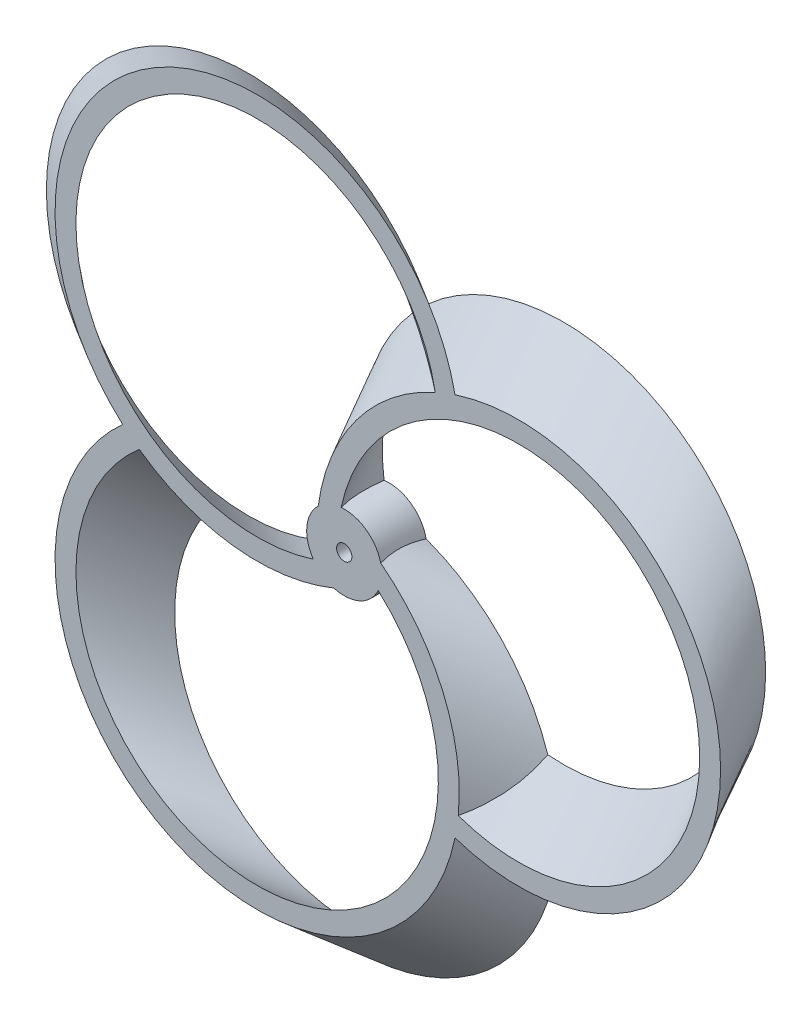
ISO-10303-21;
HEADER;
FILE_DESCRIPTION(('STEP AP214'),'2;1');
FILE_NAME('part.step','',(''),(''),'','','');
FILE_SCHEMA(('AUTOMOTIVE_DESIGN { 1 0 10303 214 1 1 1 1 }'));
ENDSEC;
DATA;
#1=APPLICATION_CONTEXT('core data for automotive mechanical design processes');
#2=APPLICATION_PROTOCOL_DEFINITION('international standard','automotive_design',2000,#1);
#3=PRODUCT_CONTEXT('',#1,'mechanical');
#4=PRODUCT('Part','Part','',(#3));
#5=PRODUCT_RELATED_PRODUCT_CATEGORY('part','',(#4));
#6=PRODUCT_DEFINITION_FORMATION('','',#4);
#7=PRODUCT_DEFINITION_CONTEXT('part definition',#1,'design');
#8=PRODUCT_DEFINITION('design','',#6,#7);
#9=PRODUCT_DEFINITION_SHAPE('','',#8);
#10=(LENGTH_UNIT() NAMED_UNIT(*) SI_UNIT(.MILLI.,.METRE.));
#11=(NAMED_UNIT(*) PLANE_ANGLE_UNIT() SI_UNIT($,.RADIAN.));
#12=(NAMED_UNIT(*) SI_UNIT($,.STERADIAN.) SOLID_ANGLE_UNIT());
#13=UNCERTAINTY_MEASURE_WITH_UNIT(LENGTH_MEASURE(1.E-05),#10,'distance_accuracy_value','');
#14=(GEOMETRIC_REPRESENTATION_CONTEXT(3) GLOBAL_UNCERTAINTY_ASSIGNED_CONTEXT((#13)) GLOBAL_UNIT_ASSIGNED_CONTEXT((#10,
#11,#12)) REPRESENTATION_CONTEXT('',''));
#15=CARTESIAN_POINT('',(0.,0.,0.));
#16=DIRECTION('',(0.,0.,1.));
#17=DIRECTION('',(1.,0.,0.));
#18=AXIS2_PLACEMENT_3D('',#15,#16,#17);
#19=CARTESIAN_POINT('',(0.,4.44959346906221,-3.23281888760861));
#20=DIRECTION('',(0.,0.,1.));
#21=DIRECTION('',(1.,0.,0.));
#22=AXIS2_PLACEMENT_3D('',#19,#20,#21);
#23=CIRCLE('',#22,13.);
#24=DIRECTION('',(0.,-0.809016994374947,0.587785252292474));
#25=VECTOR('',#24,1.);
#26=SURFACE_OF_LINEAR_EXTRUSION('',#23,#25);
#27=CARTESIAN_POINT('',(0.,0.,0.));
#28=DIRECTION('',(0.,0.,1.));
#29=DIRECTION('',(1.,0.,0.));
#30=AXIS2_PLACEMENT_3D('',#27,#28,#29);
#31=CIRCLE('',#30,13.);
#32=CARTESIAN_POINT('',(-4.32122949310312,-12.2607901730653,0.));
#33=VERTEX_POINT('',#32);
#34=CARTESIAN_POINT('',(-12.7189837148581,2.68839231905867,0.));
#35=VERTEX_POINT('',#34);
#36=EDGE_CURVE('E60',#33,#35,#31,.T.);
#37=ORIENTED_EDGE('',*,*,#36,.T.);
#38=CARTESIAN_POINT('',(-12.7189837148581,2.68839231905867,0.));
#39=CARTESIAN_POINT('',(-12.7463417927234,2.68615857240916,-0.0923844254176689));
#40=CARTESIAN_POINT('',(-12.7718338753196,2.6836667689847,-0.185319150187502));
#41=CARTESIAN_POINT('',(-12.8189369738117,2.67848003238839,-0.372170355485341));
#42=CARTESIAN_POINT('',(-12.8405476095616,2.67578507935687,-0.466086931222962));
#43=CARTESIAN_POINT('',(-12.8797372619475,2.67050505660484,-0.654783825309206));
#44=CARTESIAN_POINT('',(-12.8973154671817,2.66792000908452,-0.749564313511201));
#45=CARTESIAN_POINT('',(-12.9283501862398,2.66311223085249,-0.939796469361922));
#46=CARTESIAN_POINT('',(-12.9418069031029,2.66088948229516,-1.03524810371053));
#47=CARTESIAN_POINT('',(-12.9754810234457,2.65515803792089,-1.31862116087548));
#48=CARTESIAN_POINT('',(-12.989776671156,2.65246492852231,-1.50729629798837));
#49=CARTESIAN_POINT('',(-13.0025089545335,2.65008141766242,-1.88509885026276));
#50=CARTESIAN_POINT('',(-13.0009531788899,2.65038957937349,-2.07422600567292));
#51=CARTESIAN_POINT('',(-12.9878245433991,2.65281734198664,-2.34394061224457));
#52=CARTESIAN_POINT('',(-12.9824737432342,2.65380304428468,-2.42488601986645));
#53=CARTESIAN_POINT('',(-12.9690101636256,2.65621643668724,-2.58652999720265));
#54=CARTESIAN_POINT('',(-12.9608978873113,2.65764404627382,-2.66722860918161));
#55=CARTESIAN_POINT('',(-12.9418775326857,2.66087314117271,-2.8289914686251));
#56=CARTESIAN_POINT('',(-12.9309459688331,2.6626777417046,-2.91005287604245));
#57=CARTESIAN_POINT('',(-12.9063619642531,2.6665383299205,-3.07176661633674));
#58=CARTESIAN_POINT('',(-12.892709183851,2.66859434897533,-3.15241889685446));
#59=CARTESIAN_POINT('',(-12.8777173239326,2.67071839619004,-3.23281888760861));
#60=B_SPLINE_CURVE_WITH_KNOTS('',3,(#38,#39,#40,#41,#42,#43,#44,#45,#46,#47,#48,#49,#50,#51,#52,
#53,#54,#55,#56,#57,#58,#59),.UNSPECIFIED.,.F.,.F.,(4,2,2,2,2,2,2,2,2,2,4),(0.,
0.289113642145493,0.578255584451217,0.867455656690222,1.15664147960659,1.72360184655008,
2.29029080040493,2.5336378390645,2.77694056462379,3.02233950676622,3.26776909994948),.UNSPECIFIED.);
#61=CARTESIAN_POINT('',(-12.8777173239326,2.67071839619005,-3.23281888760861));
#62=VERTEX_POINT('',#61);
#63=EDGE_CURVE('E146',#35,#62,#60,.T.);
#64=ORIENTED_EDGE('',*,*,#63,.T.);
#65=CARTESIAN_POINT('',(0.,4.44959346906221,-3.23281888760861));
#66=DIRECTION('',(0.,0.,1.));
#67=DIRECTION('',(1.,0.,0.));
#68=AXIS2_PLACEMENT_3D('',#65,#66,#67);
#69=CIRCLE('',#68,13.);
#70=CARTESIAN_POINT('',(-1.12851168990511,-8.50133164715044,-3.23281888760861));
#71=VERTEX_POINT('',#70);
#72=EDGE_CURVE('E336',#71,#62,#69,.T.);
#73=ORIENTED_EDGE('',*,*,#72,.F.);
#74=CARTESIAN_POINT('',(-1.12851168990511,-8.50133164715044,-3.23281888760861));
#75=CARTESIAN_POINT('',(-1.18645766435644,-8.64814617753544,-3.12248080137753));
#76=CARTESIAN_POINT('',(-1.2502988430566,-8.79309059835952,-3.01284916794036));
#77=CARTESIAN_POINT('',(-1.38863222664076,-9.07864108878982,-2.79513133820698));
#78=CARTESIAN_POINT('',(-1.46310920004046,-9.21925301872113,-2.68704317092416));
#79=CARTESIAN_POINT('',(-1.62172037115464,-9.49591595256459,-2.47226542708657));
#80=CARTESIAN_POINT('',(-1.70585155738023,-9.63196836173428,-2.36557542590255));
#81=CARTESIAN_POINT('',(-1.88140983565848,-9.89695099901534,-2.15527844702374));
#82=CARTESIAN_POINT('',(-1.97268786506394,-10.0259631608396,-2.0516499303572));
#83=CARTESIAN_POINT('',(-2.16305305928808,-10.27907142084,-1.84547197766964));
#84=CARTESIAN_POINT('',(-2.26214242611901,-10.4031661178638,-1.74292285523076));
#85=CARTESIAN_POINT('',(-2.46744051634613,-10.6461193864864,-1.53881419645728));
#86=CARTESIAN_POINT('',(-2.57364910448283,-10.7649780574944,-1.43725464136365));
#87=CARTESIAN_POINT('',(-2.9256944925095,-11.1383747988034,-1.11201126192171));
#88=CARTESIAN_POINT('',(-3.18442411758121,-11.3823429845432,-0.889837189466662));
#89=CARTESIAN_POINT('',(-3.5481263079914,-11.6887739345416,-0.594326102541099));
#90=CARTESIAN_POINT('',(-3.64144886969094,-11.7644378617914,-0.519864259704357));
#91=CARTESIAN_POINT('',(-3.83096536276109,-11.9123110447375,-0.371112065703074));
#92=CARTESIAN_POINT('',(-3.92715953912305,-11.9845200042981,-0.296821729756467));
#93=CARTESIAN_POINT('',(-4.12223194822886,-12.1253663210096,-0.148345895362834));
#94=CARTESIAN_POINT('',(-4.2211105112913,-12.1940032355551,-0.0741604110104488));
#95=CARTESIAN_POINT('',(-4.32122949310312,-12.2607901730653,0.));
#96=B_SPLINE_CURVE_WITH_KNOTS('',3,(#74,#75,#76,#77,#78,#79,#80,#81,#82,#83,#84,#85,#86,#87,#88,
#89,#90,#91,#92,#93,#94,#95),.UNSPECIFIED.,.F.,.F.,(4,2,2,2,2,2,2,2,2,2,4),(0.,
0.577554499969389,1.15429002967393,1.73084614181192,2.29756004548099,2.86443428077121,
3.43129774895683,4.68674562692945,5.11075151890951,5.53479368885221,5.95888827658714),.UNSPECIFIED.);
#97=EDGE_CURVE('E292',#71,#33,#96,.T.);
#98=ORIENTED_EDGE('',*,*,#97,.T.);
#99=EDGE_LOOP('',(#37,#64,#73,#98));
#100=FACE_BOUND('',#99,.T.);
#101=ADVANCED_FACE('F43',(#100),#26,.F.);
#102=CARTESIAN_POINT('',(0.,4.44959346906221,-3.23281888760861));
#103=DIRECTION('',(0.,0.,1.));
#104=DIRECTION('',(1.,0.,0.));
#105=AXIS2_PLACEMENT_3D('',#102,#103,#104);
#106=CIRCLE('',#105,14.5);
#107=DIRECTION('',(0.,-0.809016994374947,0.587785252292474));
#108=VECTOR('',#107,1.);
#109=SURFACE_OF_LINEAR_EXTRUSION('',#106,#108);
#110=CARTESIAN_POINT('',(-14.3689837148581,1.94481541595645,0.));
#111=CARTESIAN_POINT('',(-14.3847538150584,1.9296508825989,-0.0735960266043187));
#112=CARTESIAN_POINT('',(-14.3990224233594,1.91557833195695,-0.147742582054409));
#113=CARTESIAN_POINT('',(-14.424611939459,1.88987154416126,-0.296903709137461));
#114=CARTESIAN_POINT('',(-14.435934979277,1.87823554461434,-0.371917611673274));
#115=CARTESIAN_POINT('',(-14.4557084516388,1.85763649842712,-0.522665684282725));
#116=CARTESIAN_POINT('',(-14.4641597239589,1.8486726704715,-0.598399637124876));
#117=CARTESIAN_POINT('',(-14.47819201337,1.83364878587357,-0.749102996324598));
#118=CARTESIAN_POINT('',(-14.4838194810869,1.82754185634638,-0.824063443556932));
#119=CARTESIAN_POINT('',(-14.4925566153714,1.81801182638733,-0.974305483436748));
#120=CARTESIAN_POINT('',(-14.4956660712707,1.81458895051635,-1.04958710242534));
#121=CARTESIAN_POINT('',(-14.4995221530891,1.8103385751389,-1.20027272057413));
#122=CARTESIAN_POINT('',(-14.5002689788354,1.8095108561384,-1.27567670884478));
#123=CARTESIAN_POINT('',(-14.4994229721008,1.81044692236285,-1.45580166263563));
#124=CARTESIAN_POINT('',(-14.4968066434841,1.81334445132072,-1.56051312046061));
#125=CARTESIAN_POINT('',(-14.4877305874762,1.82328744738253,-1.76961079201857));
#126=CARTESIAN_POINT('',(-14.4812688071757,1.83033513004109,-1.87399680206638));
#127=CARTESIAN_POINT('',(-14.4648453495149,1.84795408852355,-2.08227568116927));
#128=CARTESIAN_POINT('',(-14.4548806821437,1.85852837420535,-2.18616805183284));
#129=CARTESIAN_POINT('',(-14.4314432503005,1.88287710508057,-2.39585602025606));
#130=CARTESIAN_POINT('',(-14.4178884827088,1.89672541445419,-2.50163368436388));
#131=CARTESIAN_POINT('',(-14.3876462191943,1.92682452622314,-2.71227919806507));
#132=CARTESIAN_POINT('',(-14.3709618387034,1.94307293600404,-2.81714784486745));
#133=CARTESIAN_POINT('',(-14.3346540800261,1.97739121623045,-3.02575631359646));
#134=CARTESIAN_POINT('',(-14.3150393545125,1.99545567456572,-3.12949852532752));
#135=CARTESIAN_POINT('',(-14.2940117158057,2.0141819908088,-3.23281888760861));
#136=B_SPLINE_CURVE_WITH_KNOTS('',3,(#110,#111,#112,#113,#114,#115,#116,#117,#118,#119,#120,
#121,#122,#123,#124,#125,#126,#127,#128,#129,#130,#131,#132,#133,#134,#135),.UNSPECIFIED.,.F.,
.F.,(4,2,2,2,2,2,2,2,2,2,2,2,4),(0.,0.230318749066538,0.460470325310438,0.690554541461471,
0.916718532286049,1.14290144306306,1.36906522315318,1.68323448620635,1.99757162039073,
2.31217772209166,2.63470426140724,2.95691142331416,3.27818532396254),.UNSPECIFIED.);
#137=CARTESIAN_POINT('',(-14.3689837148581,1.94481541595644,0.));
#138=VERTEX_POINT('',#137);
#139=CARTESIAN_POINT('',(-14.2940117158057,2.01418199080879,-3.23281888760861));
#140=VERTEX_POINT('',#139);
#141=EDGE_CURVE('E134',#138,#140,#136,.T.);
#142=ORIENTED_EDGE('',*,*,#141,.F.);
#143=CARTESIAN_POINT('',(0.,0.,0.));
#144=DIRECTION('',(0.,0.,1.));
#145=DIRECTION('',(1.,0.,0.));
#146=AXIS2_PLACEMENT_3D('',#143,#144,#145);
#147=CIRCLE('',#146,14.5);
#148=CARTESIAN_POINT('',(-5.97122949310328,13.2134181172282,0.));
#149=VERTEX_POINT('',#148);
#150=EDGE_CURVE('E166',#149,#138,#147,.T.);
#151=ORIENTED_EDGE('',*,*,#150,.F.);
#152=CARTESIAN_POINT('',(-10.8233749826185,14.098663578955,-3.23281888760861));
#153=CARTESIAN_POINT('',(-10.6672568824348,14.1218881582256,-3.12248080137753));
#154=CARTESIAN_POINT('',(-10.5098107425142,14.1390722860758,-3.01284916794036));
#155=CARTESIAN_POINT('',(-10.1933500719464,14.1620473069156,-2.79513133820698));
#156=CARTESIAN_POINT('',(-10.0343380818509,14.1678543209201,-2.68704317092417));
#157=CARTESIAN_POINT('',(-9.71543536729986,14.168824484333,-2.47226542708658));
#158=CARTESIAN_POINT('',(-9.55554493160004,14.163990944396,-2.36557542590256));
#159=CARTESIAN_POINT('',(-9.23828409701373,14.1444443342029,-2.15527844702375));
#160=CARTESIAN_POINT('',(-9.080917272774,14.1299013228425,-2.05164993035721));
#161=CARTESIAN_POINT('',(-8.76653649259394,14.0915943586482,-1.84547197766966));
#162=CARTESIAN_POINT('',(-8.60952264908093,14.0678277982396,-1.74292285523078));
#163=CARTESIAN_POINT('',(-8.29646990140777,14.0115110710658,-1.5388141964573));
#164=CARTESIAN_POINT('',(-8.14043097878644,13.9789610711433,-1.43725464136368));
#165=CARTESIAN_POINT('',(-7.64103722110913,13.8607791924816,-1.11201126192173));
#166=CARTESIAN_POINT('',(-7.30038976200746,13.7586968573278,-0.889837189466679));
#167=CARTESIAN_POINT('',(-6.85316167959791,13.5969369960197,-0.59432610254111));
#168=CARTESIAN_POINT('',(-6.74097351559971,13.5539492504666,-0.519864259704367));
#169=CARTESIAN_POINT('',(-6.51815333609484,13.4637597445048,-0.37111206570308));
#170=CARTESIAN_POINT('',(-6.40752145455357,13.4165576238595,-0.29682172975647));
#171=CARTESIAN_POINT('',(-6.18800876169901,13.3180431203522,-0.148345895362833));
#172=CARTESIAN_POINT('',(-6.07912816853404,13.2667302301231,-0.0741604110104469));
#173=CARTESIAN_POINT('',(-5.97122949310327,13.2134181172282,0.));
#174=B_SPLINE_CURVE_WITH_KNOTS('',3,(#152,#153,#154,#155,#156,#157,#158,#159,#160,#161,#162,
#163,#164,#165,#166,#167,#168,#169,#170,#171,#172,#173),.UNSPECIFIED.,.F.,.F.,(4,2,2,2,2,2,2,2,
2,2,4),(0.,0.577554499969378,1.1542900296739,1.73084614181189,2.29756004548094,2.86443428077115,
3.43129774895676,4.6867456269294,5.11075151890947,5.53479368885217,5.95888827658711),.UNSPECIFIED.);
#175=CARTESIAN_POINT('',(-10.8233749826186,14.098663578955,-3.23281888760861));
#176=VERTEX_POINT('',#175);
#177=EDGE_CURVE('E164',#176,#149,#174,.T.);
#178=ORIENTED_EDGE('',*,*,#177,.F.);
#179=EDGE_CURVE('E154',#176,#140,#106,.T.);
#180=ORIENTED_EDGE('',*,*,#179,.T.);
#181=EDGE_LOOP('',(#142,#151,#178,#180));
#182=FACE_BOUND('',#181,.T.);
#183=ADVANCED_FACE('F162',(#182),#109,.T.);
#184=CARTESIAN_POINT('',(-22.6034609807212,8.60052081277433,-3.23281888760861));
#185=DIRECTION('',(0.,0.,1.));
#186=DIRECTION('',(-0.500000000000004,0.866025403784436,0.));
#187=AXIS2_PLACEMENT_3D('',#184,#185,#186);
#188=CIRCLE('',#187,14.5);
#189=DIRECTION('',(0.700629269222034,0.404508497187477,0.587785252292474));
#190=VECTOR('',#189,1.);
#191=SURFACE_OF_LINEAR_EXTRUSION('',#188,#190);
#192=CARTESIAN_POINT('',(-13.2497676984608,-2.59099508430477,0.));
#193=CARTESIAN_POINT('',(-13.2287497772365,-2.59707012501966,-0.0735960266043842));
#194=CARTESIAN_POINT('',(-13.209428286734,-2.60239082696402,-0.147742582054474));
#195=CARTESIAN_POINT('',(-13.1743707974035,-2.61169860407894,-0.296903709137526));
#196=CARTESIAN_POINT('',(-13.1586322062884,-2.61568664443597,-0.371917611673338));
#197=CARTESIAN_POINT('',(-13.1309061728157,-2.62251145072866,-0.522665684282789));
#198=CARTESIAN_POINT('',(-13.1189176339309,-2.62534855327435,-0.598399637124942));
#199=CARTESIAN_POINT('',(-13.0988904235,-2.62998893007867,-0.749102996324665));
#200=CARTESIAN_POINT('',(-13.0907879335319,-2.63180899531688,-0.824063443556999));
#201=CARTESIAN_POINT('',(-13.0781661183463,-2.63461056058403,-0.974305483436814));
#202=CARTESIAN_POINT('',(-13.0736470929383,-2.63559199044931,-1.04958710242541));
#203=CARTESIAN_POINT('',(-13.0680381189767,-2.63680626757434,-1.2002727205742));
#204=CARTESIAN_POINT('',(-13.0669478804219,-2.63703917814263,-1.27567670884485));
#205=CARTESIAN_POINT('',(-13.0681815409192,-2.63677454793091,-1.45580166263569));
#206=CARTESIAN_POINT('',(-13.0719990389133,-2.6359575053631,-1.56051312046067));
#207=CARTESIAN_POINT('',(-13.0851479540965,-2.633068908325,-1.76961079201863));
#208=CARTESIAN_POINT('',(-13.0944823164668,-2.63099668376037,-1.87399680206642));
#209=CARTESIAN_POINT('',(-13.1179525109313,-2.62558303144939,-2.08227568116931));
#210=CARTESIAN_POINT('',(-13.1320924446442,-2.62224051920656,-2.18616805183288));
#211=CARTESIAN_POINT('',(-13.1648977800536,-2.61411747326855,-2.39585602025609));
#212=CARTESIAN_POINT('',(-13.1836681515665,-2.60930285487855,-2.50163368436391));
#213=CARTESIAN_POINT('',(-13.224855878747,-2.59816184229151,-2.71227919806509));
#214=CARTESIAN_POINT('',(-13.2472696046338,-2.59183694983045,-2.81714784486746));
#215=CARTESIAN_POINT('',(-13.2951439864627,-2.57755264857457,-3.02575631359647));
#216=CARTESIAN_POINT('',(-13.3205956290435,-2.56959802715921,-3.12949852532752));
#217=CARTESIAN_POINT('',(-13.3473269139827,-2.56075071597907,-3.23281888760861));
#218=B_SPLINE_CURVE_WITH_KNOTS('',3,(#192,#193,#194,#195,#196,#197,#198,#199,#200,#201,#202,
#203,#204,#205,#206,#207,#208,#209,#210,#211,#212,#213,#214,#215,#216,#217),.UNSPECIFIED.,.F.,
.F.,(4,2,2,2,2,2,2,2,2,2,2,2,4),(0.,0.230318749066539,0.460470325310438,0.690554541461471,
0.91671853228605,1.14290144306306,1.36906522315318,1.68323448620634,1.99757162039071,
2.31217772209163,2.6347042614072,2.9569114233141,3.27818532396247),.UNSPECIFIED.);
#219=CARTESIAN_POINT('',(-13.2497676984608,-2.59099508430477,0.));
#220=VERTEX_POINT('',#219);
#221=CARTESIAN_POINT('',(-13.3473269139827,-2.56075071597907,-3.23281888760861));
#222=VERTEX_POINT('',#221);
#223=EDGE_CURVE('E147',#220,#222,#218,.T.);
#224=ORIENTED_EDGE('',*,*,#223,.F.);
#225=CARTESIAN_POINT('',(-18.75,10.8253175473055,0.));
#226=DIRECTION('',(0.,0.,1.));
#227=DIRECTION('',(-0.500000000000004,0.866025403784436,0.));
#228=AXIS2_PLACEMENT_3D('',#225,#226,#227);
#229=CIRCLE('',#228,14.5);
#230=CARTESIAN_POINT('',(-27.2075410137935,-0.952627944162983,0.));
#231=VERTEX_POINT('',#230);
#232=EDGE_CURVE('E167',#231,#220,#229,.T.);
#233=ORIENTED_EDGE('',*,*,#232,.F.);
#234=CARTESIAN_POINT('',(-27.2075410137935,-0.952627944162982,0.));
#235=CARTESIAN_POINT('',(-27.1974852453511,-1.10781024172505,-0.0958240883057379));
#236=CARTESIAN_POINT('',(-27.1837275633948,-1.26271140105515,-0.19167031526418));
#237=CARTESIAN_POINT('',(-27.1488051648338,-1.57155256864467,-0.383598692563256));
#238=CARTESIAN_POINT('',(-27.1276396422702,-1.72549247046546,-0.479680867444646));
#239=CARTESIAN_POINT('',(-27.0529647914315,-2.18562912716629,-0.768793887481483));
#240=CARTESIAN_POINT('',(-26.9883039156924,-2.4897274792722,-0.962437086172746));
#241=CARTESIAN_POINT('',(-26.8413555498713,-3.04208792041832,-1.32239305891755));
#242=CARTESIAN_POINT('',(-26.7633137327912,-3.29173913703731,-1.48832427503447));
#243=CARTESIAN_POINT('',(-26.5856175276696,-3.78116596917834,-1.82266202992291));
#244=CARTESIAN_POINT('',(-26.4859848437783,-4.02095121648104,-1.99106592569477));
#245=CARTESIAN_POINT('',(-26.2614567281139,-4.49434784275585,-2.33588875131675));
#246=CARTESIAN_POINT('',(-26.1359317119411,-4.72759802360199,-2.5124000489996));
#247=CARTESIAN_POINT('',(-25.929479494772,-5.06437588988879,-2.78014056959159));
#248=CARTESIAN_POINT('',(-25.8575406639586,-5.17457240043318,-2.86998889752848));
#249=CARTESIAN_POINT('',(-25.70748660592,-5.38990993179006,-3.05066780601269));
#250=CARTESIAN_POINT('',(-25.6293693259867,-5.495049253603,-3.14149870428073));
#251=CARTESIAN_POINT('',(-25.5481133274762,-5.59733193180471,-3.23281888760861));
#252=B_SPLINE_CURVE_WITH_KNOTS('',3,(#234,#235,#236,#237,#238,#239,#240,#241,#242,#243,#244,
#245,#246,#247,#248,#249,#250,#251),.UNSPECIFIED.,.F.,.F.,(4,2,2,2,2,2,2,2,4),(0.,
0.547896267708718,1.09585216402203,2.19322259724976,3.12166589121922,4.04918016451897,
5.00268083594295,5.48054042070355,5.95855944034039),.UNSPECIFIED.);
#253=CARTESIAN_POINT('',(-25.5481133274762,-5.59733193180471,-3.23281888760861));
#254=VERTEX_POINT('',#253);
#255=EDGE_CURVE('E267',#231,#254,#252,.T.);
#256=ORIENTED_EDGE('',*,*,#255,.T.);
#257=EDGE_CURVE('E173',#254,#222,#188,.T.);
#258=ORIENTED_EDGE('',*,*,#257,.T.);
#259=EDGE_LOOP('',(#224,#233,#256,#258));
#260=FACE_BOUND('',#259,.T.);
#261=ADVANCED_FACE('F183',(#260),#191,.T.);
#262=CARTESIAN_POINT('',(-14.8965390192787,-13.0501142818366,-3.23281888760861));
#263=DIRECTION('',(0.,0.,1.));
#264=DIRECTION('',(-0.499999999999992,-0.866025403784443,0.));
#265=AXIS2_PLACEMENT_3D('',#262,#263,#264);
#266=CIRCLE('',#265,14.5);
#267=DIRECTION('',(-0.70062926922204,0.404508497187467,0.587785252292474));
#268=VECTOR('',#267,1.);
#269=SURFACE_OF_LINEAR_EXTRUSION('',#266,#268);
#270=CARTESIAN_POINT('',(-9.88124858668107,0.646179668348361,0.));
#271=CARTESIAN_POINT('',(-9.8864964077051,0.667419242420791,-0.0735960266043861));
#272=CARTESIAN_POINT('',(-9.89154928990656,0.686812495007096,-0.147742582054476));
#273=CARTESIAN_POINT('',(-9.90101726313755,0.721827059917702,-0.296903709137529));
#274=CARTESIAN_POINT('',(-9.90543281443458,0.737451099821654,-0.371917611673342));
#275=CARTESIAN_POINT('',(-9.91338537554557,0.764874952301562,-0.522665684282794));
#276=CARTESIAN_POINT('',(-9.91692264211025,0.776675882802877,-0.598399637124945));
#277=CARTESIAN_POINT('',(-9.92291756313002,0.796340144205123,-0.749102996324668));
#278=CARTESIAN_POINT('',(-9.92539258538124,0.804267138970526,-0.824063443557002));
#279=CARTESIAN_POINT('',(-9.92927726628234,0.816598734196726,-0.974305483436818));
#280=CARTESIAN_POINT('',(-9.93068683579094,0.821003039932978,-1.04958710242541));
#281=CARTESIAN_POINT('',(-9.93243972793427,0.826467692435458,-1.2002727205742));
#282=CARTESIAN_POINT('',(-9.93278314074271,0.827528322004244,-1.27567670884485));
#283=CARTESIAN_POINT('',(-9.93239548698002,0.826327625568082,-1.45580166263569));
#284=CARTESIAN_POINT('',(-9.93119431760267,0.822613054042397,-1.56051312046067));
#285=CARTESIAN_POINT('',(-9.92712145842736,0.809781460942482,-1.76961079201863));
#286=CARTESIAN_POINT('',(-9.92424887635749,0.800661553719294,-1.87399680206643));
#287=CARTESIAN_POINT('',(-9.91720213955384,0.777628942925852,-2.08227568116931));
#288=CARTESIAN_POINT('',(-9.91302687321214,0.763712145001233,-2.18616805183288));
#289=CARTESIAN_POINT('',(-9.90365896964585,0.73124036818799,-2.39585602025609));
#290=CARTESIAN_POINT('',(-9.89844336572468,0.712577440424375,-2.50163368436391));
#291=CARTESIAN_POINT('',(-9.88749790205869,0.671337316068395,-2.71227919806509));
#292=CARTESIAN_POINT('',(-9.88176855666277,0.648764013826422,-2.81714784486746));
#293=CARTESIAN_POINT('',(-9.8702019335112,0.600161432344137,-3.02575631359647));
#294=CARTESIAN_POINT('',(-9.86436501644402,0.574142352593513,-3.12949852532752));
#295=CARTESIAN_POINT('',(-9.85866137021161,0.5465687251703,-3.23281888760861));
#296=B_SPLINE_CURVE_WITH_KNOTS('',3,(#270,#271,#272,#273,#274,#275,#276,#277,#278,#279,#280,
#281,#282,#283,#284,#285,#286,#287,#288,#289,#290,#291,#292,#293,#294,#295),.UNSPECIFIED.,.F.,
.F.,(4,2,2,2,2,2,2,2,2,2,2,2,4),(0.,0.230318749066538,0.460470325310437,0.690554541461471,
0.916718532286049,1.14290144306306,1.36906522315318,1.68323448620634,1.99757162039071,
2.31217772209163,2.63470426140719,2.9569114233141,3.27818532396246),.UNSPECIFIED.);
#297=CARTESIAN_POINT('',(-9.88124858668106,0.646179668348356,0.));
#298=VERTEX_POINT('',#297);
#299=CARTESIAN_POINT('',(-9.85866137021161,0.546568725170302,-3.23281888760861));
#300=VERTEX_POINT('',#299);
#301=EDGE_CURVE('E68',#298,#300,#296,.T.);
#302=ORIENTED_EDGE('',*,*,#301,.F.);
#303=CARTESIAN_POINT('',(-18.7499999999999,-10.8253175473055,0.));
#304=DIRECTION('',(0.,0.,1.));
#305=DIRECTION('',(-0.499999999999992,-0.866025403784443,0.));
#306=AXIS2_PLACEMENT_3D('',#303,#304,#305);
#307=CIRCLE('',#306,14.5);
#308=EDGE_CURVE('E255',#33,#298,#307,.T.);
#309=ORIENTED_EDGE('',*,*,#308,.F.);
#310=ORIENTED_EDGE('',*,*,#97,.F.);
#311=EDGE_CURVE('E250',#71,#300,#266,.T.);
#312=ORIENTED_EDGE('',*,*,#311,.T.);
#313=EDGE_LOOP('',(#302,#309,#310,#312));
#314=FACE_BOUND('',#313,.T.);
#315=ADVANCED_FACE('F242',(#314),#269,.T.);
#316=CARTESIAN_POINT('',(-22.6034609807212,8.60052081277433,-3.23281888760861));
#317=DIRECTION('',(0.,0.,1.));
#318=DIRECTION('',(-0.500000000000004,0.866025403784436,0.));
#319=AXIS2_PLACEMENT_3D('',#316,#317,#318);
#320=CIRCLE('',#319,13.);
#321=DIRECTION('',(0.700629269222034,0.404508497187477,0.587785252292474));
#322=VECTOR('',#321,1.);
#323=SURFACE_OF_LINEAR_EXTRUSION('',#320,#322);
#324=CARTESIAN_POINT('',(-18.75,10.8253175473055,0.));
#325=DIRECTION('',(0.,0.,1.));
#326=DIRECTION('',(-0.500000000000004,0.866025403784436,0.));
#327=AXIS2_PLACEMENT_3D('',#324,#325,#326);
#328=CIRCLE('',#327,13.);
#329=CARTESIAN_POINT('',(-14.7187241862147,-1.53384161961157,0.));
#330=VERTEX_POINT('',#329);
#331=EDGE_CURVE('E256',#149,#330,#328,.T.);
#332=ORIENTED_EDGE('',*,*,#331,.T.);
#333=CARTESIAN_POINT('',(-14.7187241862147,-1.53384161961157,0.));
#334=CARTESIAN_POINT('',(-14.703110665938,-1.55641753671685,-0.0923844254176677));
#335=CARTESIAN_POINT('',(-14.6882066595731,-1.57724842612827,-0.185319150187501));
#336=CARTESIAN_POINT('',(-14.6601632646719,-1.61544753772126,-0.37217035548534));
#337=CARTESIAN_POINT('',(-14.6470240490096,-1.63281542075681,-0.466086931222961));
#338=CARTESIAN_POINT('',(-14.6228565889808,-1.66411464391249,-0.654783825309204));
#339=CARTESIAN_POINT('',(-14.6118287695412,-1.67804529243809,-0.749564313511199));
#340=CARTESIAN_POINT('',(-14.5921477519274,-1.70251825842568,-0.939796469361921));
#341=CARTESIAN_POINT('',(-14.583494436779,-1.71306074280201,-1.03524810371053));
#342=CARTESIAN_POINT('',(-14.5616938001791,-1.73935766428184,-1.31862116087547));
#343=CARTESIAN_POINT('',(-14.5522136751696,-1.75039150366323,-1.50729629798837));
#344=CARTESIAN_POINT('',(-14.543783352526,-1.76022622908639,-1.88509885026276));
#345=CARTESIAN_POINT('',(-14.544828116218,-1.75903296871196,-2.07422600567292));
#346=CARTESIAN_POINT('',(-14.5534949380608,-1.74887711816646,-2.34394061224457));
#347=CARTESIAN_POINT('',(-14.5570239813739,-1.74473604044213,-2.42488601986645));
#348=CARTESIAN_POINT('',(-14.5658458303081,-1.73428293467652,-2.58652999720265));
#349=CARTESIAN_POINT('',(-14.5711383146339,-1.72797130209908,-2.66722860918161));
#350=CARTESIAN_POINT('',(-14.5834449701604,-1.71311373925379,-2.8289914686251));
#351=CARTESIAN_POINT('',(-14.590473581991,-1.70454902752024,-2.91005287604245));
#352=CARTESIAN_POINT('',(-14.6061089517495,-1.68518894913521,-3.07176661633674));
#353=CARTESIAN_POINT('',(-14.6147159066827,-1.67439330400207,-3.15241889685446));
#354=CARTESIAN_POINT('',(-14.6240513154887,-1.66247199607015,-3.23281888760861));
#355=B_SPLINE_CURVE_WITH_KNOTS('',3,(#333,#334,#335,#336,#337,#338,#339,#340,#341,#342,#343,
#344,#345,#346,#347,#348,#349,#350,#351,#352,#353,#354),.UNSPECIFIED.,.F.,.F.,(4,2,2,2,2,2,2,2,
2,2,4),(0.,0.289113642145493,0.578255584451217,0.867455656690222,1.15664147960659,
1.72360184655008,2.29029080040493,2.5336378390645,2.77694056462379,3.02233950676622,
3.26776909994948),.UNSPECIFIED.);
#356=CARTESIAN_POINT('',(-14.6240513154887,-1.66247199607015,-3.23281888760861));
#357=VERTEX_POINT('',#356);
#358=EDGE_CURVE('E230',#330,#357,#355,.T.);
#359=ORIENTED_EDGE('',*,*,#358,.T.);
#360=EDGE_CURVE('E155',#176,#357,#320,.T.);
#361=ORIENTED_EDGE('',*,*,#360,.F.);
#362=ORIENTED_EDGE('',*,*,#177,.T.);
#363=EDGE_LOOP('',(#332,#359,#361,#362));
#364=FACE_BOUND('',#363,.T.);
#365=ADVANCED_FACE('F247',(#364),#323,.F.);
#366=CARTESIAN_POINT('',(-22.6034609807212,8.60052081277433,-3.23281888760861));
#367=DIRECTION('',(0.,0.,1.));
#368=DIRECTION('',(-0.500000000000004,0.866025403784436,0.));
#369=AXIS2_PLACEMENT_3D('',#366,#367,#368);
#370=CIRCLE('',#369,14.5);
#371=DIRECTION('',(0.700629269222034,0.404508497187477,0.587785252292474));
#372=VECTOR('',#371,1.);
#373=SURFACE_OF_LINEAR_EXTRUSION('',#370,#372);
#374=CARTESIAN_POINT('',(-28.3968906907873,-1.13190706807487E-13,0.));
#375=CARTESIAN_POINT('',(-28.3968854743357,-0.182963552221061,-0.10452609577167));
#376=CARTESIAN_POINT('',(-28.3925597847088,-0.365897279703365,-0.209034441597905));
#377=CARTESIAN_POINT('',(-28.3752384272529,-0.7312664735775,-0.418280144104644));
#378=CARTESIAN_POINT('',(-28.3622411750265,-0.913701842795839,-0.523017539148832));
#379=CARTESIAN_POINT('',(-28.3105498200428,-1.45584206922212,-0.835801505602992));
#380=CARTESIAN_POINT('',(-28.2591553907175,-1.81408097664252,-1.044513085254));
#381=CARTESIAN_POINT('',(-28.156173271528,-2.345217626792,-1.36017529209367));
#382=CARTESIAN_POINT('',(-28.1174711814875,-2.52142585373339,-1.46595200366845));
#383=CARTESIAN_POINT('',(-28.0313307238522,-2.87110019136782,-1.67855056583211));
#384=CARTESIAN_POINT('',(-27.9838917114824,-3.04456609865421,-1.78537249300544));
#385=CARTESIAN_POINT('',(-27.8801946007043,-3.38803787248171,-2.00022503252811));
#386=CARTESIAN_POINT('',(-27.8239379748994,-3.55804431143152,-2.10825544026013));
#387=CARTESIAN_POINT('',(-27.7015851557212,-3.89637679635539,-2.32733922452438));
#388=CARTESIAN_POINT('',(-27.6353565223411,-4.06464144068583,-2.4384136952483));
#389=CARTESIAN_POINT('',(-27.4935230480916,-4.39609369168866,-2.66224386266682));
#390=CARTESIAN_POINT('',(-27.4179164401861,-4.55928033427541,-2.77499987267185));
#391=CARTESIAN_POINT('',(-27.2570737044788,-4.87970317799646,-3.00244344884712));
#392=CARTESIAN_POINT('',(-27.1718286430821,-5.03693367538341,-3.1171327217393));
#393=CARTESIAN_POINT('',(-27.0817031701097,-5.19061209548154,-3.2328188876085));
#394=B_SPLINE_CURVE_WITH_KNOTS('',3,(#374,#375,#376,#377,#378,#379,#380,#381,#382,#383,#384,
#385,#386,#387,#388,#389,#390,#391,#392,#393),.UNSPECIFIED.,.F.,.F.,(4,2,2,2,2,2,2,2,2,4),(0.,
0.632034352423887,1.26418421666004,2.51576773141947,3.14300804800756,3.77029467277923,
4.39747664768151,5.03387473895935,5.67039292562803,6.30750599455628),.UNSPECIFIED.);
#395=CARTESIAN_POINT('',(-28.3968906907873,-1.12757025938492E-13,0.));
#396=VERTEX_POINT('',#395);
#397=CARTESIAN_POINT('',(-27.0817031701092,-5.19061209548183,-3.23281888760861));
#398=VERTEX_POINT('',#397);
#399=EDGE_CURVE('E301',#396,#398,#394,.T.);
#400=ORIENTED_EDGE('',*,*,#399,.F.);
#401=CARTESIAN_POINT('',(-18.75,10.8253175473055,0.));
#402=DIRECTION('',(0.,0.,1.));
#403=DIRECTION('',(-0.500000000000004,0.866025403784436,0.));
#404=AXIS2_PLACEMENT_3D('',#401,#402,#403);
#405=CIRCLE('',#404,14.5);
#406=CARTESIAN_POINT('',(-4.55155465460637,13.7671111794062,0.));
#407=VERTEX_POINT('',#406);
#408=EDGE_CURVE('E630',#407,#396,#405,.T.);
#409=ORIENTED_EDGE('',*,*,#408,.F.);
#410=CARTESIAN_POINT('',(-9.70435035082339,15.2234314234995,-3.23281888760861));
#411=CARTESIAN_POINT('',(-9.50788743980927,15.2247614194714,-3.10524483783067));
#412=CARTESIAN_POINT('',(-9.31066095978349,15.2188005195297,-2.9788859688168));
#413=CARTESIAN_POINT('',(-8.91590116521186,15.1931791505675,-2.72850658428633));
#414=CARTESIAN_POINT('',(-8.71836840678023,15.1735333844452,-2.60448370574013));
#415=CARTESIAN_POINT('',(-8.32382722776071,15.1214284666742,-2.35843444733282));
#416=CARTESIAN_POINT('',(-8.12681871647154,15.0889716992311,-2.23640770037771));
#417=CARTESIAN_POINT('',(-7.73722186561884,15.012560206134,-1.99596846046968));
#418=CARTESIAN_POINT('',(-7.54461274144872,14.9687943623136,-1.87752930851933));
#419=CARTESIAN_POINT('',(-7.16138272169111,14.8701241439458,-1.64202079084674));
#420=CARTESIAN_POINT('',(-6.97076214949371,14.8152179864938,-1.52495164755771));
#421=CARTESIAN_POINT('',(-6.59225440420408,14.6948058029715,-1.29195756670617));
#422=CARTESIAN_POINT('',(-6.40436675760062,14.6293016375584,-1.17603243207749));
#423=CARTESIAN_POINT('',(-5.93219185625703,14.4503621118398,-0.883173391726843));
#424=CARTESIAN_POINT('',(-5.65014378240464,14.3300398702588,-0.706801445408769));
#425=CARTESIAN_POINT('',(-5.09378037192876,14.0658588527107,-0.353607339991852));
#426=CARTESIAN_POINT('',(-4.81954797679219,13.9218141776287,-0.176793460927571));
#427=CARTESIAN_POINT('',(-4.55155465460654,13.7671111794063,-1.16226472890446E-13));
#428=B_SPLINE_CURVE_WITH_KNOTS('',3,(#410,#411,#412,#413,#414,#415,#416,#417,#418,#419,#420,
#421,#422,#423,#424,#425,#426,#427),.UNSPECIFIED.,.F.,.F.,(4,2,2,2,2,2,2,2,4),(0.,
0.702550697483441,1.40434774263898,2.10601424061331,2.79664419272403,3.48738476109419,
4.17800418975556,5.23833474893252,6.30740871250801),.UNSPECIFIED.);
#429=CARTESIAN_POINT('',(-9.70435035082339,15.2234314234995,-3.23281888760861));
#430=VERTEX_POINT('',#429);
#431=EDGE_CURVE('E296',#430,#407,#428,.T.);
#432=ORIENTED_EDGE('',*,*,#431,.F.);
#433=EDGE_CURVE('E645',#430,#398,#370,.T.);
#434=ORIENTED_EDGE('',*,*,#433,.T.);
#435=EDGE_LOOP('',(#400,#409,#432,#434));
#436=FACE_BOUND('',#435,.T.);
#437=ADVANCED_FACE('F374',(#436),#373,.T.);
#438=CARTESIAN_POINT('',(-14.8965390192787,-13.0501142818366,-3.23281888760861));
#439=DIRECTION('',(0.,0.,1.));
#440=DIRECTION('',(-0.499999999999992,-0.866025403784443,0.));
#441=AXIS2_PLACEMENT_3D('',#438,#439,#440);
#442=CIRCLE('',#441,14.5);
#443=DIRECTION('',(-0.70062926922204,0.404508497187467,0.587785252292474));
#444=VECTOR('',#443,1.);
#445=SURFACE_OF_LINEAR_EXTRUSION('',#442,#444);
#446=CARTESIAN_POINT('',(-18.7499999999999,-10.8253175473055,0.));
#447=DIRECTION('',(0.,0.,1.));
#448=DIRECTION('',(-0.499999999999992,-0.866025403784443,0.));
#449=AXIS2_PLACEMENT_3D('',#446,#447,#448);
#450=CIRCLE('',#449,14.5);
#451=CARTESIAN_POINT('',(-4.55155465460621,-13.7671111794062,0.));
#452=VERTEX_POINT('',#451);
#453=EDGE_CURVE('E295',#396,#452,#450,.T.);
#454=ORIENTED_EDGE('',*,*,#453,.F.);
#455=ORIENTED_EDGE('',*,*,#399,.T.);
#456=CARTESIAN_POINT('',(-0.713946479067292,-10.0328193280178,-3.23281888760861));
#457=VERTEX_POINT('',#456);
#458=EDGE_CURVE('E667',#398,#457,#442,.T.);
#459=ORIENTED_EDGE('',*,*,#458,.T.);
#460=CARTESIAN_POINT('',(-0.713946479067293,-10.0328193280178,-3.23281888760861));
#461=CARTESIAN_POINT('',(-0.811026124275808,-10.2036261978434,-3.10524483783066));
#462=CARTESIAN_POINT('',(-0.91480165506763,-10.3714488898739,-2.9788859688168));
#463=CARTESIAN_POINT('',(-1.13437030875442,-10.7005102158846,-2.72850658428632));
#464=CARTESIAN_POINT('',(-1.25015042050899,-10.8617557197048,-2.60448370574013));
#465=CARTESIAN_POINT('',(-1.49254519247051,-11.1773859446893,-2.35843444733281));
#466=CARTESIAN_POINT('',(-1.61915783324551,-11.3317719365059,-2.23640770037769));
#467=CARTESIAN_POINT('',(-1.88013055283511,-11.6309669600302,-1.99596846046966));
#468=CARTESIAN_POINT('',(-2.01433744748667,-11.775888432652,-1.8775293085193));
#469=CARTESIAN_POINT('',(-2.29140337306901,-12.058440256071,-1.64202079084671));
#470=CARTESIAN_POINT('',(-2.43426378634527,-12.1960694353519,-1.52495164755768));
#471=CARTESIAN_POINT('',(-2.72779766884556,-12.4636606665408,-1.29195756670614));
#472=CARTESIAN_POINT('',(-2.87846976344874,-12.5936240588501,-1.17603243207746));
#473=CARTESIAN_POINT('',(-3.26952338913404,-12.9130697555838,-0.883173391726794));
#474=CARTESIAN_POINT('',(-3.51474954390967,-13.0971694318379,-0.706801445408706));
#475=CARTESIAN_POINT('',(-4.02171872154191,-13.4469037702722,-0.353607339991762));
#476=CARTESIAN_POINT('',(-4.28358126701113,-13.6123736534601,-0.176793460927467));
#477=CARTESIAN_POINT('',(-4.55155465460621,-13.7671111794062,0.));
#478=B_SPLINE_CURVE_WITH_KNOTS('',3,(#460,#461,#462,#463,#464,#465,#466,#467,#468,#469,#470,
#471,#472,#473,#474,#475,#476,#477),.UNSPECIFIED.,.F.,.F.,(4,2,2,2,2,2,2,2,4),(0.,
0.702550697483456,1.40434774263901,2.10601424061336,2.79664419272409,3.48738476109427,
4.17800418975565,5.2383347489327,6.30740871250828),.UNSPECIFIED.);
#479=EDGE_CURVE('E649',#457,#452,#478,.T.);
#480=ORIENTED_EDGE('',*,*,#479,.T.);
#481=EDGE_LOOP('',(#454,#455,#459,#480));
#482=FACE_BOUND('',#481,.T.);
#483=ADVANCED_FACE('F382',(#482),#445,.T.);
#484=CARTESIAN_POINT('',(-14.8965390192787,-13.0501142818366,-3.23281888760861));
#485=DIRECTION('',(0.,0.,1.));
#486=DIRECTION('',(-0.499999999999992,-0.866025403784443,0.));
#487=AXIS2_PLACEMENT_3D('',#484,#485,#486);
#488=CIRCLE('',#487,13.);
#489=DIRECTION('',(-0.70062926922204,0.404508497187467,0.587785252292474));
#490=VECTOR('',#489,1.);
#491=SURFACE_OF_LINEAR_EXTRUSION('',#488,#490);
#492=CARTESIAN_POINT('',(-18.7499999999999,-10.8253175473055,0.));
#493=DIRECTION('',(0.,0.,1.));
#494=DIRECTION('',(-0.499999999999992,-0.866025403784443,0.));
#495=AXIS2_PLACEMENT_3D('',#492,#493,#494);
#496=CIRCLE('',#495,13.);
#497=CARTESIAN_POINT('',(-10.0622920989272,-1.15455069944708,0.));
#498=VERTEX_POINT('',#497);
#499=EDGE_CURVE('E11',#231,#498,#496,.T.);
#500=ORIENTED_EDGE('',*,*,#499,.T.);
#501=CARTESIAN_POINT('',(-10.0622920989272,-1.15455069944708,0.));
#502=CARTESIAN_POINT('',(-10.0505475413386,-1.12974103569229,-0.0923844254176674));
#503=CARTESIAN_POINT('',(-10.0399594651074,-1.10641834285642,-0.185319150187501));
#504=CARTESIAN_POINT('',(-10.0208997615164,-1.06303249466711,-0.37217035548534));
#505=CARTESIAN_POINT('',(-10.0124283414288,-1.04296965860004,-0.466086931222961));
#506=CARTESIAN_POINT('',(-9.99740614907166,-1.00639041269234,-0.654783825309204));
#507=CARTESIAN_POINT('',(-9.99085576327714,-0.989874716646419,-0.749564313511199));
#508=CARTESIAN_POINT('',(-9.97950206183281,-0.960593972426798,-0.93979646936192));
#509=CARTESIAN_POINT('',(-9.97469866011812,-0.947828739493134,-1.03524810371053));
#510=CARTESIAN_POINT('',(-9.96282517637521,-0.915800373639028,-1.31862116087547));
#511=CARTESIAN_POINT('',(-9.9580096536744,-0.90207342485906,-1.50729629798837));
#512=CARTESIAN_POINT('',(-9.95370769294051,-0.889855188576021,-1.88509885026276));
#513=CARTESIAN_POINT('',(-9.95421870489206,-0.891356610661512,-2.07422600567292));
#514=CARTESIAN_POINT('',(-9.95868051854012,-0.903940223820172,-2.34394061224457));
#515=CARTESIAN_POINT('',(-9.96050227539188,-0.909067003842531,-2.42488601986645));
#516=CARTESIAN_POINT('',(-9.96514400606624,-0.921933502010705,-2.58652999720265));
#517=CARTESIAN_POINT('',(-9.96796379805475,-0.929672744174732,-2.66722860918161));
#518=CARTESIAN_POINT('',(-9.97467749715387,-0.947759401918906,-2.8289914686251));
#519=CARTESIAN_POINT('',(-9.97858044917589,-0.958128714184345,-2.91005287604245));
#520=CARTESIAN_POINT('',(-9.98752908399734,-0.981349380785269,-3.07176661633674));
#521=CARTESIAN_POINT('',(-9.99257490946627,-0.994201044973251,-3.15241889685446));
#522=CARTESIAN_POINT('',(-9.99823136057868,-1.00824640011988,-3.23281888760861));
#523=B_SPLINE_CURVE_WITH_KNOTS('',3,(#501,#502,#503,#504,#505,#506,#507,#508,#509,#510,#511,
#512,#513,#514,#515,#516,#517,#518,#519,#520,#521,#522),.UNSPECIFIED.,.F.,.F.,(4,2,2,2,2,2,2,2,
2,2,4),(0.,0.289113642145493,0.578255584451217,0.867455656690221,1.15664147960659,
1.72360184655007,2.29029080040492,2.5336378390645,2.77694056462379,3.02233950676622,
3.26776909994948),.UNSPECIFIED.);
#524=CARTESIAN_POINT('',(-9.99823136057867,-1.00824640011988,-3.23281888760861));
#525=VERTEX_POINT('',#524);
#526=EDGE_CURVE('E221',#498,#525,#523,.T.);
#527=ORIENTED_EDGE('',*,*,#526,.T.);
#528=EDGE_CURVE('E53',#254,#525,#488,.T.);
#529=ORIENTED_EDGE('',*,*,#528,.F.);
#530=ORIENTED_EDGE('',*,*,#255,.F.);
#531=EDGE_LOOP('',(#500,#527,#529,#530));
#532=FACE_BOUND('',#531,.T.);
#533=ADVANCED_FACE('F45',(#532),#491,.F.);
#534=CARTESIAN_POINT('',(0.,0.,0.));
#535=DIRECTION('',(0.,0.,1.));
#536=DIRECTION('',(1.,0.,0.));
#537=AXIS2_PLACEMENT_3D('',#534,#535,#536);
#538=PLANE('',#537);
#539=CARTESIAN_POINT('',(-12.5,0.,0.));
#540=DIRECTION('',(0.,0.,1.));
#541=DIRECTION('',(1.,0.,0.));
#542=AXIS2_PLACEMENT_3D('',#539,#540,#541);
#543=CIRCLE('',#542,0.55);
#544=CARTESIAN_POINT('',(-11.95,0.,0.));
#545=VERTEX_POINT('',#544);
#546=EDGE_CURVE('E158',#545,#545,#543,.F.);
#547=ORIENTED_EDGE('',*,*,#546,.T.);
#548=EDGE_LOOP('',(#547));
#549=FACE_BOUND('',#548,.T.);
#550=ORIENTED_EDGE('',*,*,#150,.T.);
#551=CARTESIAN_POINT('',(-12.5,0.,0.));
#552=DIRECTION('',(0.,0.,1.));
#553=DIRECTION('',(1.,0.,0.));
#554=AXIS2_PLACEMENT_3D('',#551,#552,#553);
#555=CIRCLE('',#554,2.69729626265761);
#556=EDGE_CURVE('E140',#330,#138,#555,.F.);
#557=ORIENTED_EDGE('',*,*,#556,.F.);
#558=ORIENTED_EDGE('',*,*,#331,.F.);
#559=EDGE_LOOP('',(#550,#557,#558));
#560=FACE_BOUND('',#559,.T.);
#561=ORIENTED_EDGE('',*,*,#232,.T.);
#562=EDGE_CURVE('E278',#498,#220,#555,.F.);
#563=ORIENTED_EDGE('',*,*,#562,.F.);
#564=ORIENTED_EDGE('',*,*,#499,.F.);
#565=EDGE_LOOP('',(#561,#563,#564));
#566=FACE_BOUND('',#565,.T.);
#567=EDGE_CURVE('E275',#35,#298,#555,.F.);
#568=ORIENTED_EDGE('',*,*,#567,.F.);
#569=ORIENTED_EDGE('',*,*,#36,.F.);
#570=ORIENTED_EDGE('',*,*,#308,.T.);
#571=EDGE_LOOP('',(#568,#569,#570));
#572=FACE_BOUND('',#571,.T.);
#573=CARTESIAN_POINT('',(0.,0.,0.));
#574=DIRECTION('',(0.,0.,1.));
#575=DIRECTION('',(1.,0.,0.));
#576=AXIS2_PLACEMENT_3D('',#573,#574,#575);
#577=CIRCLE('',#576,14.5);
#578=EDGE_CURVE('E329',#452,#407,#577,.T.);
#579=ORIENTED_EDGE('',*,*,#578,.T.);
#580=ORIENTED_EDGE('',*,*,#408,.T.);
#581=ORIENTED_EDGE('',*,*,#453,.T.);
#582=EDGE_LOOP('',(#579,#580,#581));
#583=FACE_BOUND('',#582,.T.);
#584=ADVANCED_FACE('F289',(#549,#560,#566,#572,#583),#538,.T.);
#585=CARTESIAN_POINT('',(0.,4.44959346906221,-3.23281888760861));
#586=DIRECTION('',(0.,0.,1.));
#587=DIRECTION('',(1.,0.,0.));
#588=AXIS2_PLACEMENT_3D('',#585,#586,#587);
#589=PLANE('',#588);
#590=CARTESIAN_POINT('',(-12.5,0.,-3.23281888760861));
#591=DIRECTION('',(0.,0.,-1.));
#592=DIRECTION('',(-1.,0.,0.));
#593=AXIS2_PLACEMENT_3D('',#590,#591,#592);
#594=CIRCLE('',#593,0.55);
#595=CARTESIAN_POINT('',(-13.05,0.,-3.23281888760861));
#596=VERTEX_POINT('',#595);
#597=EDGE_CURVE('E618',#596,#596,#594,.T.);
#598=ORIENTED_EDGE('',*,*,#597,.F.);
#599=EDGE_LOOP('',(#598));
#600=FACE_BOUND('',#599,.T.);
#601=CARTESIAN_POINT('',(-12.5,0.,-3.23281888760861));
#602=DIRECTION('',(0.,0.,-1.));
#603=DIRECTION('',(-1.,0.,0.));
#604=AXIS2_PLACEMENT_3D('',#601,#602,#603);
#605=CIRCLE('',#604,2.69729626265761);
#606=EDGE_CURVE('E137',#357,#140,#605,.T.);
#607=ORIENTED_EDGE('',*,*,#606,.T.);
#608=ORIENTED_EDGE('',*,*,#179,.F.);
#609=ORIENTED_EDGE('',*,*,#360,.T.);
#610=EDGE_LOOP('',(#607,#608,#609));
#611=FACE_BOUND('',#610,.T.);
#612=EDGE_CURVE('E157',#525,#222,#605,.T.);
#613=ORIENTED_EDGE('',*,*,#612,.T.);
#614=ORIENTED_EDGE('',*,*,#257,.F.);
#615=ORIENTED_EDGE('',*,*,#528,.T.);
#616=EDGE_LOOP('',(#613,#614,#615));
#617=FACE_BOUND('',#616,.T.);
#618=ORIENTED_EDGE('',*,*,#433,.F.);
#619=CARTESIAN_POINT('',(0.,4.44959346906221,-3.23281888760861));
#620=DIRECTION('',(0.,0.,1.));
#621=DIRECTION('',(1.,0.,0.));
#622=AXIS2_PLACEMENT_3D('',#619,#620,#621);
#623=CIRCLE('',#622,14.5);
#624=EDGE_CURVE('E304',#457,#430,#623,.T.);
#625=ORIENTED_EDGE('',*,*,#624,.F.);
#626=ORIENTED_EDGE('',*,*,#458,.F.);
#627=EDGE_LOOP('',(#618,#625,#626));
#628=FACE_BOUND('',#627,.T.);
#629=ORIENTED_EDGE('',*,*,#72,.T.);
#630=EDGE_CURVE('E160',#62,#300,#605,.T.);
#631=ORIENTED_EDGE('',*,*,#630,.T.);
#632=ORIENTED_EDGE('',*,*,#311,.F.);
#633=EDGE_LOOP('',(#629,#631,#632));
#634=FACE_BOUND('',#633,.T.);
#635=ADVANCED_FACE('F152',(#600,#611,#617,#628,#634),#589,.F.);
#636=DIRECTION('',(0.,-0.809016994374947,0.587785252292474));
#637=VECTOR('',#636,1.);
#638=SURFACE_OF_LINEAR_EXTRUSION('',#623,#637);
#639=ORIENTED_EDGE('',*,*,#624,.T.);
#640=ORIENTED_EDGE('',*,*,#431,.T.);
#641=ORIENTED_EDGE('',*,*,#578,.F.);
#642=ORIENTED_EDGE('',*,*,#479,.F.);
#643=EDGE_LOOP('',(#639,#640,#641,#642));
#644=FACE_BOUND('',#643,.T.);
#645=ADVANCED_FACE('F211',(#644),#638,.T.);
#646=CARTESIAN_POINT('',(-12.5,0.,7.62910591277731));
#647=DIRECTION('',(0.,0.,-1.));
#648=DIRECTION('',(-1.,0.,0.));
#649=AXIS2_PLACEMENT_3D('',#646,#647,#648);
#650=CYLINDRICAL_SURFACE('',#649,2.69729626265761);
#651=ORIENTED_EDGE('',*,*,#562,.T.);
#652=ORIENTED_EDGE('',*,*,#223,.T.);
#653=ORIENTED_EDGE('',*,*,#612,.F.);
#654=ORIENTED_EDGE('',*,*,#526,.F.);
#655=EDGE_LOOP('',(#651,#652,#653,#654));
#656=FACE_BOUND('',#655,.T.);
#657=ADVANCED_FACE('F206',(#656),#650,.T.);
#658=ORIENTED_EDGE('',*,*,#556,.T.);
#659=ORIENTED_EDGE('',*,*,#141,.T.);
#660=ORIENTED_EDGE('',*,*,#606,.F.);
#661=ORIENTED_EDGE('',*,*,#358,.F.);
#662=EDGE_LOOP('',(#658,#659,#660,#661));
#663=FACE_BOUND('',#662,.T.);
#664=ADVANCED_FACE('F136',(#663),#650,.T.);
#665=ORIENTED_EDGE('',*,*,#63,.F.);
#666=ORIENTED_EDGE('',*,*,#567,.T.);
#667=ORIENTED_EDGE('',*,*,#301,.T.);
#668=ORIENTED_EDGE('',*,*,#630,.F.);
#669=EDGE_LOOP('',(#665,#666,#667,#668));
#670=FACE_BOUND('',#669,.T.);
#671=ADVANCED_FACE('F213',(#670),#650,.T.);
#672=CARTESIAN_POINT('',(-12.5,0.,1.55563491861041));
#673=DIRECTION('',(0.,0.,-1.));
#674=DIRECTION('',(-1.,0.,0.));
#675=AXIS2_PLACEMENT_3D('',#672,#673,#674);
#676=CYLINDRICAL_SURFACE('',#675,0.55);
#677=ORIENTED_EDGE('',*,*,#597,.T.);
#678=EDGE_LOOP('',(#677));
#679=FACE_BOUND('',#678,.T.);
#680=ORIENTED_EDGE('',*,*,#546,.F.);
#681=EDGE_LOOP('',(#680));
#682=FACE_BOUND('',#681,.T.);
#683=ADVANCED_FACE('F214',(#679,#682),#676,.F.);
#684=CLOSED_SHELL('',(#101,#183,#261,#315,#365,#437,#483,#533,#584,#635,#645,#657,#664,#671,#683));
#685=MANIFOLD_SOLID_BREP('B2',#684);
#686=ADVANCED_BREP_SHAPE_REPRESENTATION('',(#18,#685),#14);
#687=SHAPE_DEFINITION_REPRESENTATION(#9,#686);
ENDSEC;
END-ISO-10303-21;
